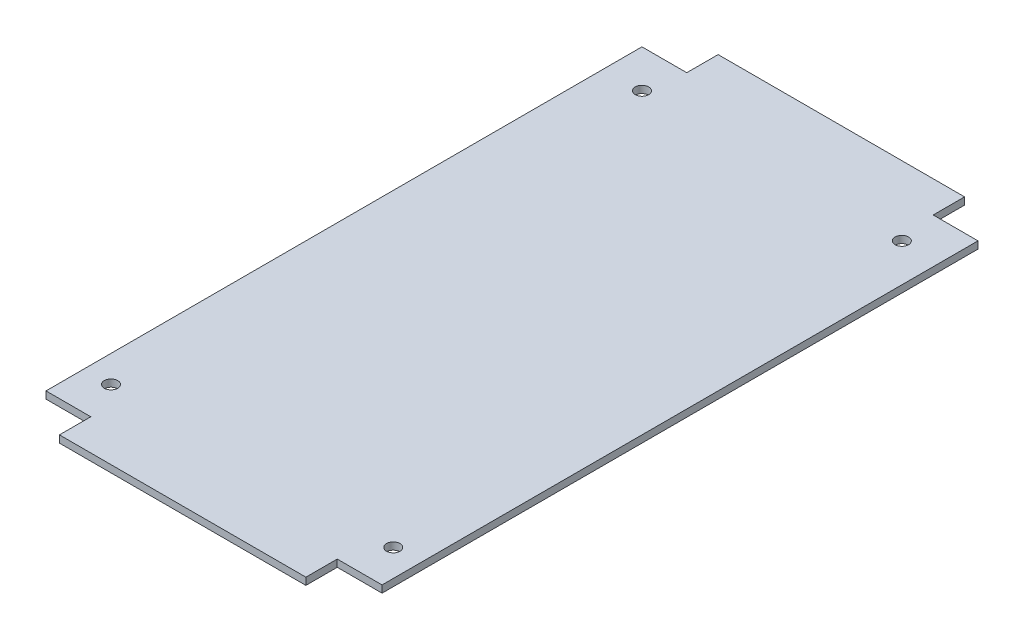
ISO-10303-21;
HEADER;
FILE_DESCRIPTION(('STEP AP214'),'2;1');
FILE_NAME('part.step','',(''),(''),'','','');
FILE_SCHEMA(('AUTOMOTIVE_DESIGN { 1 0 10303 214 1 1 1 1 }'));
ENDSEC;
DATA;
#1=APPLICATION_CONTEXT('core data for automotive mechanical design processes');
#2=APPLICATION_PROTOCOL_DEFINITION('international standard','automotive_design',2000,#1);
#3=PRODUCT_CONTEXT('',#1,'mechanical');
#4=PRODUCT('Part','Part','',(#3));
#5=PRODUCT_RELATED_PRODUCT_CATEGORY('part','',(#4));
#6=PRODUCT_DEFINITION_FORMATION('','',#4);
#7=PRODUCT_DEFINITION_CONTEXT('part definition',#1,'design');
#8=PRODUCT_DEFINITION('design','',#6,#7);
#9=PRODUCT_DEFINITION_SHAPE('','',#8);
#10=(LENGTH_UNIT() NAMED_UNIT(*) SI_UNIT(.MILLI.,.METRE.));
#11=(NAMED_UNIT(*) PLANE_ANGLE_UNIT() SI_UNIT($,.RADIAN.));
#12=(NAMED_UNIT(*) SI_UNIT($,.STERADIAN.) SOLID_ANGLE_UNIT());
#13=UNCERTAINTY_MEASURE_WITH_UNIT(LENGTH_MEASURE(1.E-05),#10,'distance_accuracy_value','');
#14=(GEOMETRIC_REPRESENTATION_CONTEXT(3) GLOBAL_UNCERTAINTY_ASSIGNED_CONTEXT((#13)) GLOBAL_UNIT_ASSIGNED_CONTEXT((#10,
#11,#12)) REPRESENTATION_CONTEXT('',''));
#15=CARTESIAN_POINT('',(0.,0.,0.));
#16=DIRECTION('',(0.,0.,1.));
#17=DIRECTION('',(1.,0.,0.));
#18=AXIS2_PLACEMENT_3D('',#15,#16,#17);
#19=CARTESIAN_POINT('',(27.5,-1.6,-66.5));
#20=DIRECTION('',(0.,-1.,0.));
#21=DIRECTION('',(0.,0.,-1.));
#22=AXIS2_PLACEMENT_3D('',#19,#20,#21);
#23=PLANE('',#22);
#24=DIRECTION('',(-1.,0.,0.));
#25=VECTOR('',#24,1.);
#26=CARTESIAN_POINT('',(-27.5,-1.6,-73.5));
#27=LINE('',#26,#25);
#28=CARTESIAN_POINT('',(27.5,-1.6,-73.5));
#29=VERTEX_POINT('',#28);
#30=CARTESIAN_POINT('',(-27.5,-1.6,-73.5));
#31=VERTEX_POINT('',#30);
#32=EDGE_CURVE('E390',#29,#31,#27,.T.);
#33=ORIENTED_EDGE('',*,*,#32,.F.);
#34=DIRECTION('',(0.,0.,-1.));
#35=VECTOR('',#34,1.);
#36=CARTESIAN_POINT('',(27.5,-1.6,-66.5));
#37=LINE('',#36,#35);
#38=CARTESIAN_POINT('',(27.5,-1.6,-66.5));
#39=VERTEX_POINT('',#38);
#40=EDGE_CURVE('E386',#39,#29,#37,.T.);
#41=ORIENTED_EDGE('',*,*,#40,.F.);
#42=DIRECTION('',(-1.,0.,0.));
#43=VECTOR('',#42,1.);
#44=CARTESIAN_POINT('',(37.5,-1.6,-66.5));
#45=LINE('',#44,#43);
#46=CARTESIAN_POINT('',(37.5,-1.6,-66.5));
#47=VERTEX_POINT('',#46);
#48=EDGE_CURVE('E121',#47,#39,#45,.T.);
#49=ORIENTED_EDGE('',*,*,#48,.F.);
#50=DIRECTION('',(0.,0.,-1.));
#51=VECTOR('',#50,1.);
#52=CARTESIAN_POINT('',(37.5,-1.6,-66.5));
#53=LINE('',#52,#51);
#54=CARTESIAN_POINT('',(37.5,-1.6,66.5));
#55=VERTEX_POINT('',#54);
#56=EDGE_CURVE('E115',#55,#47,#53,.T.);
#57=ORIENTED_EDGE('',*,*,#56,.F.);
#58=DIRECTION('',(1.,0.,0.));
#59=VECTOR('',#58,1.);
#60=CARTESIAN_POINT('',(37.5,-1.6,66.5));
#61=LINE('',#60,#59);
#62=CARTESIAN_POINT('',(27.5,-1.6,66.5));
#63=VERTEX_POINT('',#62);
#64=EDGE_CURVE('E106',#63,#55,#61,.T.);
#65=ORIENTED_EDGE('',*,*,#64,.F.);
#66=DIRECTION('',(0.,0.,-1.));
#67=VECTOR('',#66,1.);
#68=CARTESIAN_POINT('',(27.5,-1.6,66.5));
#69=LINE('',#68,#67);
#70=CARTESIAN_POINT('',(27.5,-1.6,73.5));
#71=VERTEX_POINT('',#70);
#72=EDGE_CURVE('E101',#71,#63,#69,.T.);
#73=ORIENTED_EDGE('',*,*,#72,.F.);
#74=DIRECTION('',(1.,0.,0.));
#75=VECTOR('',#74,1.);
#76=CARTESIAN_POINT('',(-27.5,-1.6,73.5));
#77=LINE('',#76,#75);
#78=CARTESIAN_POINT('',(-27.5,-1.6,73.5));
#79=VERTEX_POINT('',#78);
#80=EDGE_CURVE('E358',#79,#71,#77,.T.);
#81=ORIENTED_EDGE('',*,*,#80,.F.);
#82=DIRECTION('',(0.,0.,1.));
#83=VECTOR('',#82,1.);
#84=CARTESIAN_POINT('',(-27.5,-1.6,66.5));
#85=LINE('',#84,#83);
#86=CARTESIAN_POINT('',(-27.5,-1.6,66.5));
#87=VERTEX_POINT('',#86);
#88=EDGE_CURVE('E368',#87,#79,#85,.T.);
#89=ORIENTED_EDGE('',*,*,#88,.F.);
#90=DIRECTION('',(1.,0.,0.));
#91=VECTOR('',#90,1.);
#92=CARTESIAN_POINT('',(-37.5,-1.6,66.5));
#93=LINE('',#92,#91);
#94=CARTESIAN_POINT('',(-37.5,-1.6,66.5));
#95=VERTEX_POINT('',#94);
#96=EDGE_CURVE('E406',#95,#87,#93,.T.);
#97=ORIENTED_EDGE('',*,*,#96,.F.);
#98=DIRECTION('',(0.,0.,1.));
#99=VECTOR('',#98,1.);
#100=CARTESIAN_POINT('',(-37.5,-1.6,-66.5));
#101=LINE('',#100,#99);
#102=CARTESIAN_POINT('',(-37.5,-1.6,-66.5));
#103=VERTEX_POINT('',#102);
#104=EDGE_CURVE('E402',#103,#95,#101,.T.);
#105=ORIENTED_EDGE('',*,*,#104,.F.);
#106=DIRECTION('',(-1.,0.,0.));
#107=VECTOR('',#106,1.);
#108=CARTESIAN_POINT('',(-37.5,-1.6,-66.5));
#109=LINE('',#108,#107);
#110=CARTESIAN_POINT('',(-27.5,-1.6,-66.5));
#111=VERTEX_POINT('',#110);
#112=EDGE_CURVE('E398',#111,#103,#109,.T.);
#113=ORIENTED_EDGE('',*,*,#112,.F.);
#114=DIRECTION('',(0.,0.,1.));
#115=VECTOR('',#114,1.);
#116=CARTESIAN_POINT('',(-27.5,-1.6,-66.5));
#117=LINE('',#116,#115);
#118=EDGE_CURVE('E394',#31,#111,#117,.T.);
#119=ORIENTED_EDGE('',*,*,#118,.F.);
#120=EDGE_LOOP('',(#33,#41,#49,#57,#65,#73,#81,#89,#97,#105,#113,#119));
#121=FACE_BOUND('',#120,.T.);
#122=CARTESIAN_POINT('',(-29.,-1.6,-58.));
#123=DIRECTION('',(0.,1.,0.));
#124=DIRECTION('',(0.,0.,1.));
#125=AXIS2_PLACEMENT_3D('',#122,#123,#124);
#126=CIRCLE('',#125,1.5);
#127=CARTESIAN_POINT('',(-29.,-1.6,-56.5));
#128=VERTEX_POINT('',#127);
#129=EDGE_CURVE('E125',#128,#128,#126,.T.);
#130=ORIENTED_EDGE('',*,*,#129,.T.);
#131=EDGE_LOOP('',(#130));
#132=FACE_BOUND('',#131,.T.);
#133=CARTESIAN_POINT('',(-31.5,-1.6,58.));
#134=DIRECTION('',(0.,1.,0.));
#135=DIRECTION('',(0.,0.,1.));
#136=AXIS2_PLACEMENT_3D('',#133,#134,#135);
#137=CIRCLE('',#136,1.5);
#138=CARTESIAN_POINT('',(-31.5,-1.6,59.5));
#139=VERTEX_POINT('',#138);
#140=EDGE_CURVE('E148',#139,#139,#137,.T.);
#141=ORIENTED_EDGE('',*,*,#140,.T.);
#142=EDGE_LOOP('',(#141));
#143=FACE_BOUND('',#142,.T.);
#144=CARTESIAN_POINT('',(31.5,-1.6,58.));
#145=DIRECTION('',(0.,1.,0.));
#146=DIRECTION('',(0.,0.,1.));
#147=AXIS2_PLACEMENT_3D('',#144,#145,#146);
#148=CIRCLE('',#147,1.5);
#149=CARTESIAN_POINT('',(31.5,-1.6,59.5));
#150=VERTEX_POINT('',#149);
#151=EDGE_CURVE('E150',#150,#150,#148,.T.);
#152=ORIENTED_EDGE('',*,*,#151,.T.);
#153=EDGE_LOOP('',(#152));
#154=FACE_BOUND('',#153,.T.);
#155=CARTESIAN_POINT('',(29.,-1.6,-58.));
#156=DIRECTION('',(0.,1.,0.));
#157=DIRECTION('',(0.,0.,1.));
#158=AXIS2_PLACEMENT_3D('',#155,#156,#157);
#159=CIRCLE('',#158,1.5);
#160=CARTESIAN_POINT('',(29.,-1.6,-56.5));
#161=VERTEX_POINT('',#160);
#162=EDGE_CURVE('E19',#161,#161,#159,.T.);
#163=ORIENTED_EDGE('',*,*,#162,.T.);
#164=EDGE_LOOP('',(#163));
#165=FACE_BOUND('',#164,.T.);
#166=ADVANCED_FACE('F16',(#121,#132,#143,#154,#165),#23,.T.);
#167=CARTESIAN_POINT('',(29.,-1.6,-58.));
#168=DIRECTION('',(0.,1.,0.));
#169=DIRECTION('',(0.,0.,1.));
#170=AXIS2_PLACEMENT_3D('',#167,#168,#169);
#171=CYLINDRICAL_SURFACE('',#170,1.5);
#172=ORIENTED_EDGE('',*,*,#162,.F.);
#173=EDGE_LOOP('',(#172));
#174=FACE_BOUND('',#173,.T.);
#175=CARTESIAN_POINT('',(29.,0.,-58.));
#176=DIRECTION('',(0.,1.,0.));
#177=DIRECTION('',(0.,0.,1.));
#178=AXIS2_PLACEMENT_3D('',#175,#176,#177);
#179=CIRCLE('',#178,1.5);
#180=CARTESIAN_POINT('',(29.,0.,-56.5));
#181=VERTEX_POINT('',#180);
#182=EDGE_CURVE('E143',#181,#181,#179,.T.);
#183=ORIENTED_EDGE('',*,*,#182,.T.);
#184=EDGE_LOOP('',(#183));
#185=FACE_BOUND('',#184,.T.);
#186=ADVANCED_FACE('F158',(#174,#185),#171,.F.);
#187=CARTESIAN_POINT('',(31.5,-1.6,58.));
#188=DIRECTION('',(0.,1.,0.));
#189=DIRECTION('',(0.,0.,1.));
#190=AXIS2_PLACEMENT_3D('',#187,#188,#189);
#191=CYLINDRICAL_SURFACE('',#190,1.5);
#192=ORIENTED_EDGE('',*,*,#151,.F.);
#193=EDGE_LOOP('',(#192));
#194=FACE_BOUND('',#193,.T.);
#195=CARTESIAN_POINT('',(31.5,0.,58.));
#196=DIRECTION('',(0.,1.,0.));
#197=DIRECTION('',(0.,0.,1.));
#198=AXIS2_PLACEMENT_3D('',#195,#196,#197);
#199=CIRCLE('',#198,1.5);
#200=CARTESIAN_POINT('',(31.5,0.,59.5));
#201=VERTEX_POINT('',#200);
#202=EDGE_CURVE('E140',#201,#201,#199,.T.);
#203=ORIENTED_EDGE('',*,*,#202,.T.);
#204=EDGE_LOOP('',(#203));
#205=FACE_BOUND('',#204,.T.);
#206=ADVANCED_FACE('F161',(#194,#205),#191,.F.);
#207=CARTESIAN_POINT('',(-31.5,-1.6,58.));
#208=DIRECTION('',(0.,1.,0.));
#209=DIRECTION('',(0.,0.,1.));
#210=AXIS2_PLACEMENT_3D('',#207,#208,#209);
#211=CYLINDRICAL_SURFACE('',#210,1.5);
#212=ORIENTED_EDGE('',*,*,#140,.F.);
#213=EDGE_LOOP('',(#212));
#214=FACE_BOUND('',#213,.T.);
#215=CARTESIAN_POINT('',(-31.5,0.,58.));
#216=DIRECTION('',(0.,1.,0.));
#217=DIRECTION('',(0.,0.,1.));
#218=AXIS2_PLACEMENT_3D('',#215,#216,#217);
#219=CIRCLE('',#218,1.5);
#220=CARTESIAN_POINT('',(-31.5,0.,59.5));
#221=VERTEX_POINT('',#220);
#222=EDGE_CURVE('E137',#221,#221,#219,.T.);
#223=ORIENTED_EDGE('',*,*,#222,.T.);
#224=EDGE_LOOP('',(#223));
#225=FACE_BOUND('',#224,.T.);
#226=ADVANCED_FACE('F219',(#214,#225),#211,.F.);
#227=CARTESIAN_POINT('',(-29.,-1.6,-58.));
#228=DIRECTION('',(0.,1.,0.));
#229=DIRECTION('',(0.,0.,1.));
#230=AXIS2_PLACEMENT_3D('',#227,#228,#229);
#231=CYLINDRICAL_SURFACE('',#230,1.5);
#232=ORIENTED_EDGE('',*,*,#129,.F.);
#233=EDGE_LOOP('',(#232));
#234=FACE_BOUND('',#233,.T.);
#235=CARTESIAN_POINT('',(-29.,0.,-58.));
#236=DIRECTION('',(0.,1.,0.));
#237=DIRECTION('',(0.,0.,1.));
#238=AXIS2_PLACEMENT_3D('',#235,#236,#237);
#239=CIRCLE('',#238,1.5);
#240=CARTESIAN_POINT('',(-29.,0.,-56.5));
#241=VERTEX_POINT('',#240);
#242=EDGE_CURVE('E134',#241,#241,#239,.T.);
#243=ORIENTED_EDGE('',*,*,#242,.T.);
#244=EDGE_LOOP('',(#243));
#245=FACE_BOUND('',#244,.T.);
#246=ADVANCED_FACE('F216',(#234,#245),#231,.F.);
#247=CARTESIAN_POINT('',(37.5,-1.6,-66.5));
#248=DIRECTION('',(1.,0.,0.));
#249=DIRECTION('',(0.,0.,-1.));
#250=AXIS2_PLACEMENT_3D('',#247,#248,#249);
#251=PLANE('',#250);
#252=ORIENTED_EDGE('',*,*,#56,.T.);
#253=DIRECTION('',(0.,1.,0.));
#254=VECTOR('',#253,1.);
#255=CARTESIAN_POINT('',(37.5,-1.6,-66.5));
#256=LINE('',#255,#254);
#257=CARTESIAN_POINT('',(37.5,0.,-66.5));
#258=VERTEX_POINT('',#257);
#259=EDGE_CURVE('E382',#258,#47,#256,.F.);
#260=ORIENTED_EDGE('',*,*,#259,.F.);
#261=DIRECTION('',(0.,0.,-1.));
#262=VECTOR('',#261,1.);
#263=CARTESIAN_POINT('',(37.5,0.,-66.5));
#264=LINE('',#263,#262);
#265=CARTESIAN_POINT('',(37.5,0.,66.5));
#266=VERTEX_POINT('',#265);
#267=EDGE_CURVE('E129',#258,#266,#264,.F.);
#268=ORIENTED_EDGE('',*,*,#267,.T.);
#269=DIRECTION('',(0.,1.,0.));
#270=VECTOR('',#269,1.);
#271=CARTESIAN_POINT('',(37.5,-1.6,66.5));
#272=LINE('',#271,#270);
#273=EDGE_CURVE('E111',#55,#266,#272,.T.);
#274=ORIENTED_EDGE('',*,*,#273,.F.);
#275=EDGE_LOOP('',(#252,#260,#268,#274));
#276=FACE_BOUND('',#275,.T.);
#277=ADVANCED_FACE('F128',(#276),#251,.T.);
#278=CARTESIAN_POINT('',(37.5,-1.6,66.5));
#279=DIRECTION('',(0.,0.,1.));
#280=DIRECTION('',(1.,0.,0.));
#281=AXIS2_PLACEMENT_3D('',#278,#279,#280);
#282=PLANE('',#281);
#283=ORIENTED_EDGE('',*,*,#64,.T.);
#284=ORIENTED_EDGE('',*,*,#273,.T.);
#285=DIRECTION('',(1.,0.,0.));
#286=VECTOR('',#285,1.);
#287=CARTESIAN_POINT('',(27.5,0.,66.5));
#288=LINE('',#287,#286);
#289=CARTESIAN_POINT('',(27.5,0.,66.5));
#290=VERTEX_POINT('',#289);
#291=EDGE_CURVE('E372',#266,#290,#288,.F.);
#292=ORIENTED_EDGE('',*,*,#291,.T.);
#293=DIRECTION('',(0.,1.,0.));
#294=VECTOR('',#293,1.);
#295=CARTESIAN_POINT('',(27.5,-1.6,66.5));
#296=LINE('',#295,#294);
#297=EDGE_CURVE('E113',#63,#290,#296,.T.);
#298=ORIENTED_EDGE('',*,*,#297,.F.);
#299=EDGE_LOOP('',(#283,#284,#292,#298));
#300=FACE_BOUND('',#299,.T.);
#301=ADVANCED_FACE('F108',(#300),#282,.T.);
#302=CARTESIAN_POINT('',(27.5,-1.6,66.5));
#303=DIRECTION('',(1.,0.,0.));
#304=DIRECTION('',(0.,0.,-1.));
#305=AXIS2_PLACEMENT_3D('',#302,#303,#304);
#306=PLANE('',#305);
#307=ORIENTED_EDGE('',*,*,#72,.T.);
#308=ORIENTED_EDGE('',*,*,#297,.T.);
#309=DIRECTION('',(0.,0.,-1.));
#310=VECTOR('',#309,1.);
#311=CARTESIAN_POINT('',(27.5,0.,-66.5));
#312=LINE('',#311,#310);
#313=CARTESIAN_POINT('',(27.5,0.,73.5));
#314=VERTEX_POINT('',#313);
#315=EDGE_CURVE('E367',#290,#314,#312,.F.);
#316=ORIENTED_EDGE('',*,*,#315,.T.);
#317=DIRECTION('',(0.,1.,0.));
#318=VECTOR('',#317,1.);
#319=CARTESIAN_POINT('',(27.5,-1.6,73.5));
#320=LINE('',#319,#318);
#321=EDGE_CURVE('E360',#71,#314,#320,.T.);
#322=ORIENTED_EDGE('',*,*,#321,.F.);
#323=EDGE_LOOP('',(#307,#308,#316,#322));
#324=FACE_BOUND('',#323,.T.);
#325=ADVANCED_FACE('F208',(#324),#306,.T.);
#326=CARTESIAN_POINT('',(-27.5,-1.6,73.5));
#327=DIRECTION('',(0.,0.,1.));
#328=DIRECTION('',(1.,0.,0.));
#329=AXIS2_PLACEMENT_3D('',#326,#327,#328);
#330=PLANE('',#329);
#331=ORIENTED_EDGE('',*,*,#80,.T.);
#332=ORIENTED_EDGE('',*,*,#321,.T.);
#333=DIRECTION('',(1.,0.,0.));
#334=VECTOR('',#333,1.);
#335=CARTESIAN_POINT('',(27.5,0.,73.5));
#336=LINE('',#335,#334);
#337=CARTESIAN_POINT('',(-27.5,0.,73.5));
#338=VERTEX_POINT('',#337);
#339=EDGE_CURVE('E374',#314,#338,#336,.F.);
#340=ORIENTED_EDGE('',*,*,#339,.T.);
#341=DIRECTION('',(0.,1.,0.));
#342=VECTOR('',#341,1.);
#343=CARTESIAN_POINT('',(-27.5,-1.6,73.5));
#344=LINE('',#343,#342);
#345=EDGE_CURVE('E362',#79,#338,#344,.T.);
#346=ORIENTED_EDGE('',*,*,#345,.F.);
#347=EDGE_LOOP('',(#331,#332,#340,#346));
#348=FACE_BOUND('',#347,.T.);
#349=ADVANCED_FACE('F204',(#348),#330,.T.);
#350=CARTESIAN_POINT('',(-27.5,-1.6,66.5));
#351=DIRECTION('',(-1.,0.,0.));
#352=DIRECTION('',(0.,0.,1.));
#353=AXIS2_PLACEMENT_3D('',#350,#351,#352);
#354=PLANE('',#353);
#355=ORIENTED_EDGE('',*,*,#88,.T.);
#356=ORIENTED_EDGE('',*,*,#345,.T.);
#357=DIRECTION('',(0.,0.,-1.));
#358=VECTOR('',#357,1.);
#359=CARTESIAN_POINT('',(-27.5,0.,-66.5));
#360=LINE('',#359,#358);
#361=CARTESIAN_POINT('',(-27.5,0.,66.5));
#362=VERTEX_POINT('',#361);
#363=EDGE_CURVE('E409',#338,#362,#360,.T.);
#364=ORIENTED_EDGE('',*,*,#363,.T.);
#365=DIRECTION('',(0.,1.,0.));
#366=VECTOR('',#365,1.);
#367=CARTESIAN_POINT('',(-27.5,-1.6,66.5));
#368=LINE('',#367,#366);
#369=EDGE_CURVE('E404',#87,#362,#368,.T.);
#370=ORIENTED_EDGE('',*,*,#369,.F.);
#371=EDGE_LOOP('',(#355,#356,#364,#370));
#372=FACE_BOUND('',#371,.T.);
#373=ADVANCED_FACE('F200',(#372),#354,.T.);
#374=CARTESIAN_POINT('',(-37.5,-1.6,66.5));
#375=DIRECTION('',(0.,0.,1.));
#376=DIRECTION('',(1.,0.,0.));
#377=AXIS2_PLACEMENT_3D('',#374,#375,#376);
#378=PLANE('',#377);
#379=ORIENTED_EDGE('',*,*,#96,.T.);
#380=ORIENTED_EDGE('',*,*,#369,.T.);
#381=DIRECTION('',(1.,0.,0.));
#382=VECTOR('',#381,1.);
#383=CARTESIAN_POINT('',(27.5,0.,66.5));
#384=LINE('',#383,#382);
#385=CARTESIAN_POINT('',(-37.5,0.,66.5));
#386=VERTEX_POINT('',#385);
#387=EDGE_CURVE('E413',#362,#386,#384,.F.);
#388=ORIENTED_EDGE('',*,*,#387,.T.);
#389=DIRECTION('',(0.,1.,0.));
#390=VECTOR('',#389,1.);
#391=CARTESIAN_POINT('',(-37.5,-1.6,66.5));
#392=LINE('',#391,#390);
#393=EDGE_CURVE('E400',#95,#386,#392,.T.);
#394=ORIENTED_EDGE('',*,*,#393,.F.);
#395=EDGE_LOOP('',(#379,#380,#388,#394));
#396=FACE_BOUND('',#395,.T.);
#397=ADVANCED_FACE('F196',(#396),#378,.T.);
#398=CARTESIAN_POINT('',(-37.5,-1.6,-66.5));
#399=DIRECTION('',(-1.,0.,0.));
#400=DIRECTION('',(0.,0.,1.));
#401=AXIS2_PLACEMENT_3D('',#398,#399,#400);
#402=PLANE('',#401);
#403=ORIENTED_EDGE('',*,*,#104,.T.);
#404=ORIENTED_EDGE('',*,*,#393,.T.);
#405=DIRECTION('',(0.,0.,-1.));
#406=VECTOR('',#405,1.);
#407=CARTESIAN_POINT('',(-37.5,0.,-66.5));
#408=LINE('',#407,#406);
#409=CARTESIAN_POINT('',(-37.5,0.,-66.5));
#410=VERTEX_POINT('',#409);
#411=EDGE_CURVE('E417',#386,#410,#408,.T.);
#412=ORIENTED_EDGE('',*,*,#411,.T.);
#413=DIRECTION('',(0.,1.,0.));
#414=VECTOR('',#413,1.);
#415=CARTESIAN_POINT('',(-37.5,-1.6,-66.5));
#416=LINE('',#415,#414);
#417=EDGE_CURVE('E396',#103,#410,#416,.T.);
#418=ORIENTED_EDGE('',*,*,#417,.F.);
#419=EDGE_LOOP('',(#403,#404,#412,#418));
#420=FACE_BOUND('',#419,.T.);
#421=ADVANCED_FACE('F192',(#420),#402,.T.);
#422=CARTESIAN_POINT('',(-37.5,-1.6,-66.5));
#423=DIRECTION('',(0.,0.,-1.));
#424=DIRECTION('',(-1.,0.,0.));
#425=AXIS2_PLACEMENT_3D('',#422,#423,#424);
#426=PLANE('',#425);
#427=ORIENTED_EDGE('',*,*,#112,.T.);
#428=ORIENTED_EDGE('',*,*,#417,.T.);
#429=DIRECTION('',(1.,0.,0.));
#430=VECTOR('',#429,1.);
#431=CARTESIAN_POINT('',(27.5,0.,-66.5));
#432=LINE('',#431,#430);
#433=CARTESIAN_POINT('',(-27.5,0.,-66.5));
#434=VERTEX_POINT('',#433);
#435=EDGE_CURVE('E420',#410,#434,#432,.T.);
#436=ORIENTED_EDGE('',*,*,#435,.T.);
#437=DIRECTION('',(0.,1.,0.));
#438=VECTOR('',#437,1.);
#439=CARTESIAN_POINT('',(-27.5,-1.6,-66.5));
#440=LINE('',#439,#438);
#441=EDGE_CURVE('E392',#111,#434,#440,.T.);
#442=ORIENTED_EDGE('',*,*,#441,.F.);
#443=EDGE_LOOP('',(#427,#428,#436,#442));
#444=FACE_BOUND('',#443,.T.);
#445=ADVANCED_FACE('F188',(#444),#426,.T.);
#446=CARTESIAN_POINT('',(-27.5,-1.6,-66.5));
#447=DIRECTION('',(-1.,0.,0.));
#448=DIRECTION('',(0.,0.,1.));
#449=AXIS2_PLACEMENT_3D('',#446,#447,#448);
#450=PLANE('',#449);
#451=ORIENTED_EDGE('',*,*,#118,.T.);
#452=ORIENTED_EDGE('',*,*,#441,.T.);
#453=DIRECTION('',(0.,0.,-1.));
#454=VECTOR('',#453,1.);
#455=CARTESIAN_POINT('',(-27.5,0.,-66.5));
#456=LINE('',#455,#454);
#457=CARTESIAN_POINT('',(-27.5,0.,-73.5));
#458=VERTEX_POINT('',#457);
#459=EDGE_CURVE('E423',#434,#458,#456,.T.);
#460=ORIENTED_EDGE('',*,*,#459,.T.);
#461=DIRECTION('',(0.,1.,0.));
#462=VECTOR('',#461,1.);
#463=CARTESIAN_POINT('',(-27.5,-1.6,-73.5));
#464=LINE('',#463,#462);
#465=EDGE_CURVE('E388',#31,#458,#464,.T.);
#466=ORIENTED_EDGE('',*,*,#465,.F.);
#467=EDGE_LOOP('',(#451,#452,#460,#466));
#468=FACE_BOUND('',#467,.T.);
#469=ADVANCED_FACE('F184',(#468),#450,.T.);
#470=CARTESIAN_POINT('',(-27.5,-1.6,-73.5));
#471=DIRECTION('',(0.,0.,-1.));
#472=DIRECTION('',(-1.,0.,0.));
#473=AXIS2_PLACEMENT_3D('',#470,#471,#472);
#474=PLANE('',#473);
#475=ORIENTED_EDGE('',*,*,#32,.T.);
#476=ORIENTED_EDGE('',*,*,#465,.T.);
#477=DIRECTION('',(1.,0.,0.));
#478=VECTOR('',#477,1.);
#479=CARTESIAN_POINT('',(27.5,0.,-73.5));
#480=LINE('',#479,#478);
#481=CARTESIAN_POINT('',(27.5,0.,-73.5));
#482=VERTEX_POINT('',#481);
#483=EDGE_CURVE('E426',#458,#482,#480,.T.);
#484=ORIENTED_EDGE('',*,*,#483,.T.);
#485=DIRECTION('',(0.,1.,0.));
#486=VECTOR('',#485,1.);
#487=CARTESIAN_POINT('',(27.5,-1.6,-73.5));
#488=LINE('',#487,#486);
#489=EDGE_CURVE('E384',#29,#482,#488,.T.);
#490=ORIENTED_EDGE('',*,*,#489,.F.);
#491=EDGE_LOOP('',(#475,#476,#484,#490));
#492=FACE_BOUND('',#491,.T.);
#493=ADVANCED_FACE('F180',(#492),#474,.T.);
#494=CARTESIAN_POINT('',(27.5,-1.6,-66.5));
#495=DIRECTION('',(1.,0.,0.));
#496=DIRECTION('',(0.,0.,-1.));
#497=AXIS2_PLACEMENT_3D('',#494,#495,#496);
#498=PLANE('',#497);
#499=ORIENTED_EDGE('',*,*,#40,.T.);
#500=ORIENTED_EDGE('',*,*,#489,.T.);
#501=DIRECTION('',(0.,0.,-1.));
#502=VECTOR('',#501,1.);
#503=CARTESIAN_POINT('',(27.5,0.,-66.5));
#504=LINE('',#503,#502);
#505=CARTESIAN_POINT('',(27.5,0.,-66.5));
#506=VERTEX_POINT('',#505);
#507=EDGE_CURVE('E25',#482,#506,#504,.F.);
#508=ORIENTED_EDGE('',*,*,#507,.T.);
#509=DIRECTION('',(0.,1.,0.));
#510=VECTOR('',#509,1.);
#511=CARTESIAN_POINT('',(27.5,-1.6,-66.5));
#512=LINE('',#511,#510);
#513=EDGE_CURVE('E33',#39,#506,#512,.T.);
#514=ORIENTED_EDGE('',*,*,#513,.F.);
#515=EDGE_LOOP('',(#499,#500,#508,#514));
#516=FACE_BOUND('',#515,.T.);
#517=ADVANCED_FACE('F173',(#516),#498,.T.);
#518=CARTESIAN_POINT('',(37.5,-1.6,-66.5));
#519=DIRECTION('',(0.,0.,-1.));
#520=DIRECTION('',(-1.,0.,0.));
#521=AXIS2_PLACEMENT_3D('',#518,#519,#520);
#522=PLANE('',#521);
#523=ORIENTED_EDGE('',*,*,#48,.T.);
#524=ORIENTED_EDGE('',*,*,#513,.T.);
#525=DIRECTION('',(1.,0.,0.));
#526=VECTOR('',#525,1.);
#527=CARTESIAN_POINT('',(27.5,0.,-66.5));
#528=LINE('',#527,#526);
#529=EDGE_CURVE('E11',#506,#258,#528,.T.);
#530=ORIENTED_EDGE('',*,*,#529,.T.);
#531=ORIENTED_EDGE('',*,*,#259,.T.);
#532=EDGE_LOOP('',(#523,#524,#530,#531));
#533=FACE_BOUND('',#532,.T.);
#534=ADVANCED_FACE('F166',(#533),#522,.T.);
#535=CARTESIAN_POINT('',(27.5,0.,-66.5));
#536=DIRECTION('',(0.,-1.,0.));
#537=DIRECTION('',(0.,0.,-1.));
#538=AXIS2_PLACEMENT_3D('',#535,#536,#537);
#539=PLANE('',#538);
#540=ORIENTED_EDGE('',*,*,#507,.F.);
#541=ORIENTED_EDGE('',*,*,#483,.F.);
#542=ORIENTED_EDGE('',*,*,#459,.F.);
#543=ORIENTED_EDGE('',*,*,#435,.F.);
#544=ORIENTED_EDGE('',*,*,#411,.F.);
#545=ORIENTED_EDGE('',*,*,#387,.F.);
#546=ORIENTED_EDGE('',*,*,#363,.F.);
#547=ORIENTED_EDGE('',*,*,#339,.F.);
#548=ORIENTED_EDGE('',*,*,#315,.F.);
#549=ORIENTED_EDGE('',*,*,#291,.F.);
#550=ORIENTED_EDGE('',*,*,#267,.F.);
#551=ORIENTED_EDGE('',*,*,#529,.F.);
#552=EDGE_LOOP('',(#540,#541,#542,#543,#544,#545,#546,#547,#548,#549,#550,#551));
#553=FACE_BOUND('',#552,.T.);
#554=ORIENTED_EDGE('',*,*,#242,.F.);
#555=EDGE_LOOP('',(#554));
#556=FACE_BOUND('',#555,.T.);
#557=ORIENTED_EDGE('',*,*,#222,.F.);
#558=EDGE_LOOP('',(#557));
#559=FACE_BOUND('',#558,.T.);
#560=ORIENTED_EDGE('',*,*,#202,.F.);
#561=EDGE_LOOP('',(#560));
#562=FACE_BOUND('',#561,.T.);
#563=ORIENTED_EDGE('',*,*,#182,.F.);
#564=EDGE_LOOP('',(#563));
#565=FACE_BOUND('',#564,.T.);
#566=ADVANCED_FACE('F164',(#553,#556,#559,#562,#565),#539,.F.);
#567=CLOSED_SHELL('',(#166,#186,#206,#226,#246,#277,#301,#325,#349,#373,#397,#421,#445,#469,
#493,#517,#534,#566));
#568=MANIFOLD_SOLID_BREP('B1',#567);
#569=ADVANCED_BREP_SHAPE_REPRESENTATION('',(#18,#568),#14);
#570=SHAPE_DEFINITION_REPRESENTATION(#9,#569);
ENDSEC;
END-ISO-10303-21;
